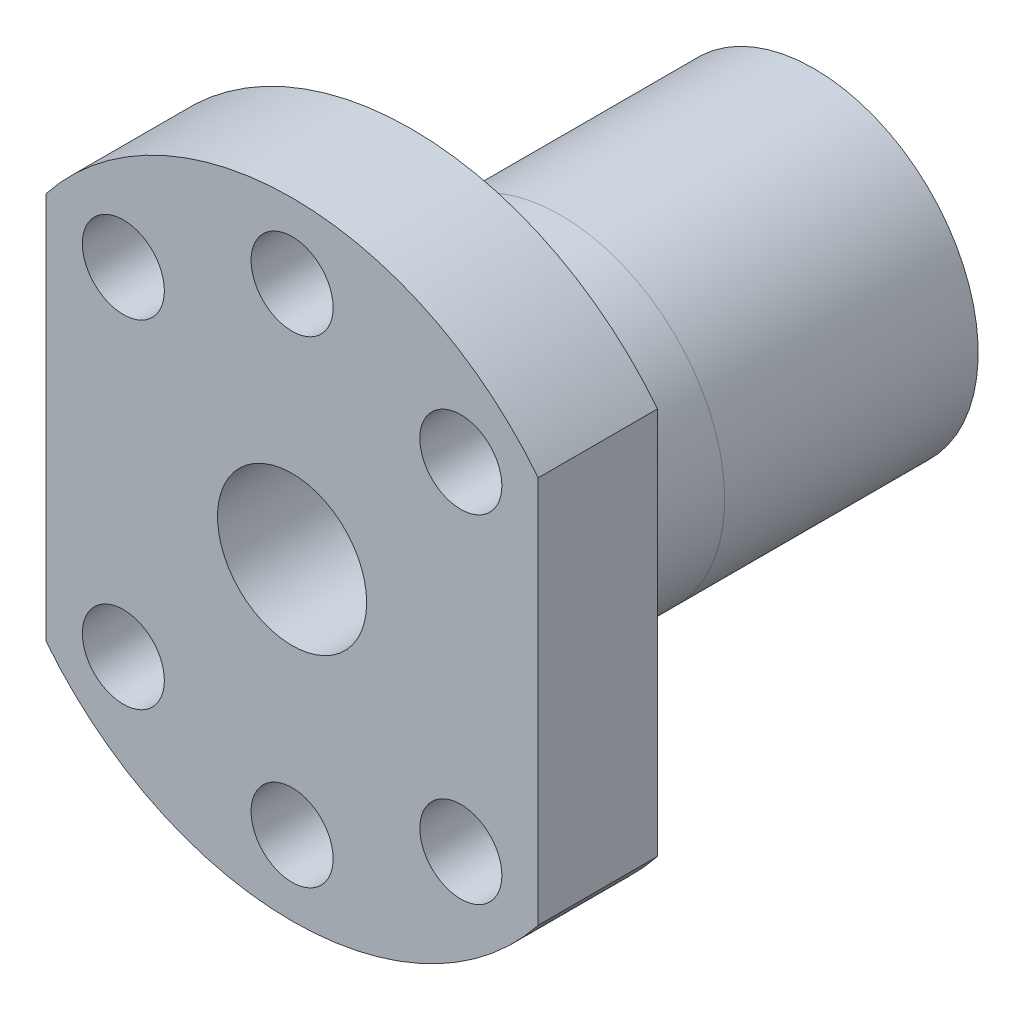
ISO-10303-21;
HEADER;
FILE_DESCRIPTION(('STEP AP214'),'2;1');
FILE_NAME('part.step','',(''),(''),'','','');
FILE_SCHEMA(('AUTOMOTIVE_DESIGN { 1 0 10303 214 1 1 1 1 }'));
ENDSEC;
DATA;
#1=APPLICATION_CONTEXT('core data for automotive mechanical design processes');
#2=APPLICATION_PROTOCOL_DEFINITION('international standard','automotive_design',2000,#1);
#3=PRODUCT_CONTEXT('',#1,'mechanical');
#4=PRODUCT('Part','Part','',(#3));
#5=PRODUCT_RELATED_PRODUCT_CATEGORY('part','',(#4));
#6=PRODUCT_DEFINITION_FORMATION('','',#4);
#7=PRODUCT_DEFINITION_CONTEXT('part definition',#1,'design');
#8=PRODUCT_DEFINITION('design','',#6,#7);
#9=PRODUCT_DEFINITION_SHAPE('','',#8);
#10=(LENGTH_UNIT() NAMED_UNIT(*) SI_UNIT(.MILLI.,.METRE.));
#11=(NAMED_UNIT(*) PLANE_ANGLE_UNIT() SI_UNIT($,.RADIAN.));
#12=(NAMED_UNIT(*) SI_UNIT($,.STERADIAN.) SOLID_ANGLE_UNIT());
#13=UNCERTAINTY_MEASURE_WITH_UNIT(LENGTH_MEASURE(1.E-05),#10,'distance_accuracy_value','');
#14=(GEOMETRIC_REPRESENTATION_CONTEXT(3) GLOBAL_UNCERTAINTY_ASSIGNED_CONTEXT((#13)) GLOBAL_UNIT_ASSIGNED_CONTEXT((#10,
#11,#12)) REPRESENTATION_CONTEXT('',''));
#15=CARTESIAN_POINT('',(0.,0.,0.));
#16=DIRECTION('',(0.,0.,1.));
#17=DIRECTION('',(1.,0.,0.));
#18=AXIS2_PLACEMENT_3D('',#15,#16,#17);
#19=CARTESIAN_POINT('',(0.,0.,4.));
#20=DIRECTION('',(0.,0.,1.));
#21=DIRECTION('',(0.,-1.,0.));
#22=AXIS2_PLACEMENT_3D('',#19,#20,#21);
#23=CYLINDRICAL_SURFACE('',#22,11.);
#24=CARTESIAN_POINT('',(0.,0.,-4.));
#25=DIRECTION('',(0.,0.,1.));
#26=DIRECTION('',(0.,-1.,0.));
#27=AXIS2_PLACEMENT_3D('',#24,#25,#26);
#28=CIRCLE('',#27,11.);
#29=CARTESIAN_POINT('',(0.,-11.,-4.));
#30=VERTEX_POINT('',#29);
#31=EDGE_CURVE('E116',#30,#30,#28,.T.);
#32=ORIENTED_EDGE('',*,*,#31,.F.);
#33=EDGE_LOOP('',(#32));
#34=FACE_BOUND('',#33,.T.);
#35=CARTESIAN_POINT('',(0.,0.,-14.));
#36=DIRECTION('',(0.,0.,-1.));
#37=DIRECTION('',(0.,1.,0.));
#38=AXIS2_PLACEMENT_3D('',#35,#36,#37);
#39=CIRCLE('',#38,11.);
#40=CARTESIAN_POINT('',(0.,11.,-14.));
#41=VERTEX_POINT('',#40);
#42=CARTESIAN_POINT('',(0.,-11.,-14.));
#43=VERTEX_POINT('',#42);
#44=EDGE_CURVE('E11',#41,#43,#39,.T.);
#45=ORIENTED_EDGE('',*,*,#44,.F.);
#46=EDGE_CURVE('E47',#43,#41,#39,.T.);
#47=ORIENTED_EDGE('',*,*,#46,.F.);
#48=EDGE_LOOP('',(#45,#47));
#49=FACE_BOUND('',#48,.T.);
#50=ADVANCED_FACE('F43',(#34,#49),#23,.T.);
#51=CARTESIAN_POINT('',(0.,0.,4.));
#52=DIRECTION('',(0.,0.,-1.));
#53=DIRECTION('',(0.,1.,0.));
#54=AXIS2_PLACEMENT_3D('',#51,#52,#53);
#55=PLANE('',#54);
#56=CARTESIAN_POINT('',(0.,0.,4.));
#57=DIRECTION('',(0.,0.,1.));
#58=DIRECTION('',(1.,0.,0.));
#59=AXIS2_PLACEMENT_3D('',#56,#57,#58);
#60=CIRCLE('',#59,5.);
#61=CARTESIAN_POINT('',(5.,0.,4.));
#62=VERTEX_POINT('',#61);
#63=EDGE_CURVE('E171',#62,#62,#60,.T.);
#64=ORIENTED_EDGE('',*,*,#63,.F.);
#65=EDGE_LOOP('',(#64));
#66=FACE_BOUND('',#65,.T.);
#67=CARTESIAN_POINT('',(0.,-16.,4.));
#68=DIRECTION('',(0.,0.,-1.));
#69=DIRECTION('',(1.,0.,0.));
#70=AXIS2_PLACEMENT_3D('',#67,#68,#69);
#71=CIRCLE('',#70,2.75);
#72=CARTESIAN_POINT('',(2.75,-16.,4.));
#73=VERTEX_POINT('',#72);
#74=EDGE_CURVE('E160',#73,#73,#71,.T.);
#75=ORIENTED_EDGE('',*,*,#74,.T.);
#76=EDGE_LOOP('',(#75));
#77=FACE_BOUND('',#76,.T.);
#78=CARTESIAN_POINT('',(11.3137084989848,-11.3137084989847,4.));
#79=DIRECTION('',(0.,0.,-1.));
#80=DIRECTION('',(1.,0.,0.));
#81=AXIS2_PLACEMENT_3D('',#78,#79,#80);
#82=CIRCLE('',#81,2.75);
#83=CARTESIAN_POINT('',(14.0637084989848,-11.3137084989847,4.));
#84=VERTEX_POINT('',#83);
#85=EDGE_CURVE('E148',#84,#84,#82,.T.);
#86=ORIENTED_EDGE('',*,*,#85,.T.);
#87=EDGE_LOOP('',(#86));
#88=FACE_BOUND('',#87,.T.);
#89=CARTESIAN_POINT('',(-11.3137084989848,-11.3137084989847,4.));
#90=DIRECTION('',(0.,0.,-1.));
#91=DIRECTION('',(1.,0.,0.));
#92=AXIS2_PLACEMENT_3D('',#89,#90,#91);
#93=CIRCLE('',#92,2.75);
#94=CARTESIAN_POINT('',(-8.56370849898478,-11.3137084989847,4.));
#95=VERTEX_POINT('',#94);
#96=EDGE_CURVE('E142',#95,#95,#93,.T.);
#97=ORIENTED_EDGE('',*,*,#96,.T.);
#98=EDGE_LOOP('',(#97));
#99=FACE_BOUND('',#98,.T.);
#100=DIRECTION('',(0.,-1.,0.));
#101=VECTOR('',#100,1.);
#102=CARTESIAN_POINT('',(16.5,12.9903810567666,4.));
#103=LINE('',#102,#101);
#104=CARTESIAN_POINT('',(16.5,12.9903810567666,4.));
#105=VERTEX_POINT('',#104);
#106=CARTESIAN_POINT('',(16.5,-12.9903810567666,4.));
#107=VERTEX_POINT('',#106);
#108=EDGE_CURVE('E88',#105,#107,#103,.T.);
#109=ORIENTED_EDGE('',*,*,#108,.F.);
#110=CARTESIAN_POINT('',(0.,0.,4.));
#111=DIRECTION('',(0.,0.,1.));
#112=DIRECTION('',(0.,-1.,0.));
#113=AXIS2_PLACEMENT_3D('',#110,#111,#112);
#114=CIRCLE('',#113,21.);
#115=CARTESIAN_POINT('',(-16.5,12.9903810567666,4.));
#116=VERTEX_POINT('',#115);
#117=EDGE_CURVE('E102',#105,#116,#114,.T.);
#118=ORIENTED_EDGE('',*,*,#117,.T.);
#119=DIRECTION('',(0.,1.,0.));
#120=VECTOR('',#119,1.);
#121=CARTESIAN_POINT('',(-16.5,-12.9903810567666,4.));
#122=LINE('',#121,#120);
#123=CARTESIAN_POINT('',(-16.5,-12.9903810567666,4.));
#124=VERTEX_POINT('',#123);
#125=EDGE_CURVE('E126',#124,#116,#122,.T.);
#126=ORIENTED_EDGE('',*,*,#125,.F.);
#127=EDGE_CURVE('E105',#124,#107,#114,.T.);
#128=ORIENTED_EDGE('',*,*,#127,.T.);
#129=EDGE_LOOP('',(#109,#118,#126,#128));
#130=FACE_BOUND('',#129,.T.);
#131=CARTESIAN_POINT('',(-11.3137084989848,11.3137084989847,4.));
#132=DIRECTION('',(0.,0.,1.));
#133=DIRECTION('',(1.,0.,0.));
#134=AXIS2_PLACEMENT_3D('',#131,#132,#133);
#135=CIRCLE('',#134,2.75);
#136=CARTESIAN_POINT('',(-8.56370849898478,11.3137084989847,4.));
#137=VERTEX_POINT('',#136);
#138=EDGE_CURVE('E131',#137,#137,#135,.T.);
#139=ORIENTED_EDGE('',*,*,#138,.F.);
#140=EDGE_LOOP('',(#139));
#141=FACE_BOUND('',#140,.T.);
#142=CARTESIAN_POINT('',(11.3137084989848,11.3137084989847,4.));
#143=DIRECTION('',(0.,0.,1.));
#144=DIRECTION('',(1.,0.,0.));
#145=AXIS2_PLACEMENT_3D('',#142,#143,#144);
#146=CIRCLE('',#145,2.75);
#147=CARTESIAN_POINT('',(14.0637084989848,11.3137084989847,4.));
#148=VERTEX_POINT('',#147);
#149=EDGE_CURVE('E136',#148,#148,#146,.T.);
#150=ORIENTED_EDGE('',*,*,#149,.F.);
#151=EDGE_LOOP('',(#150));
#152=FACE_BOUND('',#151,.T.);
#153=CARTESIAN_POINT('',(0.,16.,4.));
#154=DIRECTION('',(0.,0.,1.));
#155=DIRECTION('',(1.,0.,0.));
#156=AXIS2_PLACEMENT_3D('',#153,#154,#155);
#157=CIRCLE('',#156,2.75);
#158=CARTESIAN_POINT('',(2.75,16.,4.));
#159=VERTEX_POINT('',#158);
#160=EDGE_CURVE('E154',#159,#159,#157,.T.);
#161=ORIENTED_EDGE('',*,*,#160,.F.);
#162=EDGE_LOOP('',(#161));
#163=FACE_BOUND('',#162,.T.);
#164=ADVANCED_FACE('F45',(#66,#77,#88,#99,#130,#141,#152,#163),#55,.F.);
#165=CARTESIAN_POINT('',(0.,21.,-4.));
#166=DIRECTION('',(0.,0.,1.));
#167=DIRECTION('',(0.,-1.,0.));
#168=AXIS2_PLACEMENT_3D('',#165,#166,#167);
#169=PLANE('',#168);
#170=CARTESIAN_POINT('',(0.,-16.,-4.));
#171=DIRECTION('',(0.,0.,-1.));
#172=DIRECTION('',(1.,0.,0.));
#173=AXIS2_PLACEMENT_3D('',#170,#171,#172);
#174=CIRCLE('',#173,2.75);
#175=CARTESIAN_POINT('',(2.75,-16.,-4.));
#176=VERTEX_POINT('',#175);
#177=EDGE_CURVE('E163',#176,#176,#174,.T.);
#178=ORIENTED_EDGE('',*,*,#177,.F.);
#179=EDGE_LOOP('',(#178));
#180=FACE_BOUND('',#179,.T.);
#181=CARTESIAN_POINT('',(11.3137084989848,-11.3137084989847,-4.));
#182=DIRECTION('',(0.,0.,-1.));
#183=DIRECTION('',(1.,0.,0.));
#184=AXIS2_PLACEMENT_3D('',#181,#182,#183);
#185=CIRCLE('',#184,2.75);
#186=CARTESIAN_POINT('',(14.0637084989848,-11.3137084989847,-4.));
#187=VERTEX_POINT('',#186);
#188=EDGE_CURVE('E151',#187,#187,#185,.T.);
#189=ORIENTED_EDGE('',*,*,#188,.F.);
#190=EDGE_LOOP('',(#189));
#191=FACE_BOUND('',#190,.T.);
#192=CARTESIAN_POINT('',(-11.3137084989848,-11.3137084989847,-4.));
#193=DIRECTION('',(0.,0.,-1.));
#194=DIRECTION('',(1.,0.,0.));
#195=AXIS2_PLACEMENT_3D('',#192,#193,#194);
#196=CIRCLE('',#195,2.75);
#197=CARTESIAN_POINT('',(-8.56370849898478,-11.3137084989847,-4.));
#198=VERTEX_POINT('',#197);
#199=EDGE_CURVE('E145',#198,#198,#196,.T.);
#200=ORIENTED_EDGE('',*,*,#199,.F.);
#201=EDGE_LOOP('',(#200));
#202=FACE_BOUND('',#201,.T.);
#203=ORIENTED_EDGE('',*,*,#31,.T.);
#204=EDGE_LOOP('',(#203));
#205=FACE_BOUND('',#204,.T.);
#206=DIRECTION('',(0.,-1.,0.));
#207=VECTOR('',#206,1.);
#208=CARTESIAN_POINT('',(16.5,12.9903810567666,-4.));
#209=LINE('',#208,#207);
#210=CARTESIAN_POINT('',(16.5,12.9903810567666,-4.));
#211=VERTEX_POINT('',#210);
#212=CARTESIAN_POINT('',(16.5,-12.9903810567666,-4.));
#213=VERTEX_POINT('',#212);
#214=EDGE_CURVE('E91',#211,#213,#209,.T.);
#215=ORIENTED_EDGE('',*,*,#214,.T.);
#216=CARTESIAN_POINT('',(0.,0.,-4.));
#217=DIRECTION('',(0.,0.,1.));
#218=DIRECTION('',(0.,-1.,0.));
#219=AXIS2_PLACEMENT_3D('',#216,#217,#218);
#220=CIRCLE('',#219,21.);
#221=CARTESIAN_POINT('',(-16.5,-12.9903810567666,-4.));
#222=VERTEX_POINT('',#221);
#223=EDGE_CURVE('E111',#222,#213,#220,.T.);
#224=ORIENTED_EDGE('',*,*,#223,.F.);
#225=DIRECTION('',(0.,1.,0.));
#226=VECTOR('',#225,1.);
#227=CARTESIAN_POINT('',(-16.5,-12.9903810567666,-4.));
#228=LINE('',#227,#226);
#229=CARTESIAN_POINT('',(-16.5,12.9903810567666,-4.));
#230=VERTEX_POINT('',#229);
#231=EDGE_CURVE('E95',#222,#230,#228,.T.);
#232=ORIENTED_EDGE('',*,*,#231,.T.);
#233=EDGE_CURVE('E113',#211,#230,#220,.T.);
#234=ORIENTED_EDGE('',*,*,#233,.F.);
#235=EDGE_LOOP('',(#215,#224,#232,#234));
#236=FACE_BOUND('',#235,.T.);
#237=CARTESIAN_POINT('',(-11.3137084989848,11.3137084989847,-4.));
#238=DIRECTION('',(0.,0.,1.));
#239=DIRECTION('',(1.,0.,0.));
#240=AXIS2_PLACEMENT_3D('',#237,#238,#239);
#241=CIRCLE('',#240,2.75);
#242=CARTESIAN_POINT('',(-8.56370849898478,11.3137084989847,-4.));
#243=VERTEX_POINT('',#242);
#244=EDGE_CURVE('E133',#243,#243,#241,.T.);
#245=ORIENTED_EDGE('',*,*,#244,.T.);
#246=EDGE_LOOP('',(#245));
#247=FACE_BOUND('',#246,.T.);
#248=CARTESIAN_POINT('',(11.3137084989848,11.3137084989847,-4.));
#249=DIRECTION('',(0.,0.,1.));
#250=DIRECTION('',(1.,0.,0.));
#251=AXIS2_PLACEMENT_3D('',#248,#249,#250);
#252=CIRCLE('',#251,2.75);
#253=CARTESIAN_POINT('',(14.0637084989848,11.3137084989847,-4.));
#254=VERTEX_POINT('',#253);
#255=EDGE_CURVE('E139',#254,#254,#252,.T.);
#256=ORIENTED_EDGE('',*,*,#255,.T.);
#257=EDGE_LOOP('',(#256));
#258=FACE_BOUND('',#257,.T.);
#259=CARTESIAN_POINT('',(0.,16.,-4.));
#260=DIRECTION('',(0.,0.,1.));
#261=DIRECTION('',(1.,0.,0.));
#262=AXIS2_PLACEMENT_3D('',#259,#260,#261);
#263=CIRCLE('',#262,2.75);
#264=CARTESIAN_POINT('',(2.75,16.,-4.));
#265=VERTEX_POINT('',#264);
#266=EDGE_CURVE('E157',#265,#265,#263,.T.);
#267=ORIENTED_EDGE('',*,*,#266,.T.);
#268=EDGE_LOOP('',(#267));
#269=FACE_BOUND('',#268,.T.);
#270=ADVANCED_FACE('F179',(#180,#191,#202,#205,#236,#247,#258,#269),#169,.F.);
#271=CARTESIAN_POINT('',(0.,0.,4.));
#272=DIRECTION('',(0.,0.,1.));
#273=DIRECTION('',(0.,-1.,0.));
#274=AXIS2_PLACEMENT_3D('',#271,#272,#273);
#275=CYLINDRICAL_SURFACE('',#274,21.);
#276=DIRECTION('',(0.,0.,-1.));
#277=VECTOR('',#276,1.);
#278=CARTESIAN_POINT('',(16.5,12.9903810567666,4.));
#279=LINE('',#278,#277);
#280=EDGE_CURVE('E85',#105,#211,#279,.T.);
#281=ORIENTED_EDGE('',*,*,#280,.T.);
#282=ORIENTED_EDGE('',*,*,#233,.T.);
#283=DIRECTION('',(0.,0.,-1.));
#284=VECTOR('',#283,1.);
#285=CARTESIAN_POINT('',(-16.5,12.9903810567666,4.));
#286=LINE('',#285,#284);
#287=EDGE_CURVE('E110',#116,#230,#286,.T.);
#288=ORIENTED_EDGE('',*,*,#287,.F.);
#289=ORIENTED_EDGE('',*,*,#117,.F.);
#290=EDGE_LOOP('',(#281,#282,#288,#289));
#291=FACE_BOUND('',#290,.T.);
#292=ADVANCED_FACE('F108',(#291),#275,.T.);
#293=DIRECTION('',(0.,0.,-1.));
#294=VECTOR('',#293,1.);
#295=CARTESIAN_POINT('',(16.5,-12.9903810567666,4.));
#296=LINE('',#295,#294);
#297=EDGE_CURVE('E96',#107,#213,#296,.T.);
#298=ORIENTED_EDGE('',*,*,#297,.F.);
#299=ORIENTED_EDGE('',*,*,#127,.F.);
#300=DIRECTION('',(0.,0.,-1.));
#301=VECTOR('',#300,1.);
#302=CARTESIAN_POINT('',(-16.5,-12.9903810567666,4.));
#303=LINE('',#302,#301);
#304=EDGE_CURVE('E122',#124,#222,#303,.T.);
#305=ORIENTED_EDGE('',*,*,#304,.T.);
#306=ORIENTED_EDGE('',*,*,#223,.T.);
#307=EDGE_LOOP('',(#298,#299,#305,#306));
#308=FACE_BOUND('',#307,.T.);
#309=ADVANCED_FACE('F231',(#308),#275,.T.);
#310=ORIENTED_EDGE('',*,*,#46,.T.);
#311=ORIENTED_EDGE('',*,*,#44,.T.);
#312=EDGE_LOOP('',(#310,#311));
#313=FACE_BOUND('',#312,.T.);
#314=CARTESIAN_POINT('',(0.,0.,-31.));
#315=DIRECTION('',(0.,0.,1.));
#316=DIRECTION('',(0.,-1.,0.));
#317=AXIS2_PLACEMENT_3D('',#314,#315,#316);
#318=CIRCLE('',#317,11.);
#319=CARTESIAN_POINT('',(0.,-11.,-31.));
#320=VERTEX_POINT('',#319);
#321=EDGE_CURVE('E119',#320,#320,#318,.T.);
#322=ORIENTED_EDGE('',*,*,#321,.T.);
#323=EDGE_LOOP('',(#322));
#324=FACE_BOUND('',#323,.T.);
#325=ADVANCED_FACE('F224',(#313,#324),#23,.T.);
#326=CARTESIAN_POINT('',(0.,11.,-31.));
#327=DIRECTION('',(0.,0.,1.));
#328=DIRECTION('',(0.,-1.,0.));
#329=AXIS2_PLACEMENT_3D('',#326,#327,#328);
#330=PLANE('',#329);
#331=CARTESIAN_POINT('',(0.,0.,-31.));
#332=DIRECTION('',(0.,0.,1.));
#333=DIRECTION('',(1.,0.,0.));
#334=AXIS2_PLACEMENT_3D('',#331,#332,#333);
#335=CIRCLE('',#334,5.);
#336=CARTESIAN_POINT('',(5.,0.,-31.));
#337=VERTEX_POINT('',#336);
#338=EDGE_CURVE('E166',#337,#337,#335,.T.);
#339=ORIENTED_EDGE('',*,*,#338,.T.);
#340=EDGE_LOOP('',(#339));
#341=FACE_BOUND('',#340,.T.);
#342=ORIENTED_EDGE('',*,*,#321,.F.);
#343=EDGE_LOOP('',(#342));
#344=FACE_BOUND('',#343,.T.);
#345=ADVANCED_FACE('F230',(#341,#344),#330,.F.);
#346=CARTESIAN_POINT('',(-16.5,-12.9903810567666,4.));
#347=DIRECTION('',(-1.,0.,0.));
#348=DIRECTION('',(0.,0.,1.));
#349=AXIS2_PLACEMENT_3D('',#346,#347,#348);
#350=PLANE('',#349);
#351=ORIENTED_EDGE('',*,*,#231,.F.);
#352=ORIENTED_EDGE('',*,*,#304,.F.);
#353=ORIENTED_EDGE('',*,*,#125,.T.);
#354=ORIENTED_EDGE('',*,*,#287,.T.);
#355=EDGE_LOOP('',(#351,#352,#353,#354));
#356=FACE_BOUND('',#355,.T.);
#357=ADVANCED_FACE('F235',(#356),#350,.T.);
#358=CARTESIAN_POINT('',(16.5,12.9903810567666,4.));
#359=DIRECTION('',(1.,0.,0.));
#360=DIRECTION('',(0.,0.,-1.));
#361=AXIS2_PLACEMENT_3D('',#358,#359,#360);
#362=PLANE('',#361);
#363=ORIENTED_EDGE('',*,*,#214,.F.);
#364=ORIENTED_EDGE('',*,*,#280,.F.);
#365=ORIENTED_EDGE('',*,*,#108,.T.);
#366=ORIENTED_EDGE('',*,*,#297,.T.);
#367=EDGE_LOOP('',(#363,#364,#365,#366));
#368=FACE_BOUND('',#367,.T.);
#369=ADVANCED_FACE('F87',(#368),#362,.T.);
#370=CARTESIAN_POINT('',(-11.3137084989848,11.3137084989847,4.));
#371=DIRECTION('',(0.,0.,-1.));
#372=DIRECTION('',(-1.,0.,0.));
#373=AXIS2_PLACEMENT_3D('',#370,#371,#372);
#374=CYLINDRICAL_SURFACE('',#373,2.75);
#375=ORIENTED_EDGE('',*,*,#138,.T.);
#376=EDGE_LOOP('',(#375));
#377=FACE_BOUND('',#376,.T.);
#378=ORIENTED_EDGE('',*,*,#244,.F.);
#379=EDGE_LOOP('',(#378));
#380=FACE_BOUND('',#379,.T.);
#381=ADVANCED_FACE('F256',(#377,#380),#374,.F.);
#382=CARTESIAN_POINT('',(11.3137084989848,11.3137084989847,4.));
#383=DIRECTION('',(0.,0.,-1.));
#384=DIRECTION('',(-1.,0.,0.));
#385=AXIS2_PLACEMENT_3D('',#382,#383,#384);
#386=CYLINDRICAL_SURFACE('',#385,2.75);
#387=ORIENTED_EDGE('',*,*,#149,.T.);
#388=EDGE_LOOP('',(#387));
#389=FACE_BOUND('',#388,.T.);
#390=ORIENTED_EDGE('',*,*,#255,.F.);
#391=EDGE_LOOP('',(#390));
#392=FACE_BOUND('',#391,.T.);
#393=ADVANCED_FACE('F190',(#389,#392),#386,.F.);
#394=CARTESIAN_POINT('',(-11.3137084989848,-11.3137084989847,4.));
#395=DIRECTION('',(0.,0.,-1.));
#396=DIRECTION('',(-1.,0.,0.));
#397=AXIS2_PLACEMENT_3D('',#394,#395,#396);
#398=CYLINDRICAL_SURFACE('',#397,2.75);
#399=ORIENTED_EDGE('',*,*,#96,.F.);
#400=EDGE_LOOP('',(#399));
#401=FACE_BOUND('',#400,.T.);
#402=ORIENTED_EDGE('',*,*,#199,.T.);
#403=EDGE_LOOP('',(#402));
#404=FACE_BOUND('',#403,.T.);
#405=ADVANCED_FACE('F186',(#401,#404),#398,.F.);
#406=CARTESIAN_POINT('',(11.3137084989848,-11.3137084989847,4.));
#407=DIRECTION('',(0.,0.,-1.));
#408=DIRECTION('',(-1.,0.,0.));
#409=AXIS2_PLACEMENT_3D('',#406,#407,#408);
#410=CYLINDRICAL_SURFACE('',#409,2.75);
#411=ORIENTED_EDGE('',*,*,#85,.F.);
#412=EDGE_LOOP('',(#411));
#413=FACE_BOUND('',#412,.T.);
#414=ORIENTED_EDGE('',*,*,#188,.T.);
#415=EDGE_LOOP('',(#414));
#416=FACE_BOUND('',#415,.T.);
#417=ADVANCED_FACE('F189',(#413,#416),#410,.F.);
#418=CARTESIAN_POINT('',(0.,16.,4.));
#419=DIRECTION('',(0.,0.,-1.));
#420=DIRECTION('',(-1.,0.,0.));
#421=AXIS2_PLACEMENT_3D('',#418,#419,#420);
#422=CYLINDRICAL_SURFACE('',#421,2.75);
#423=ORIENTED_EDGE('',*,*,#160,.T.);
#424=EDGE_LOOP('',(#423));
#425=FACE_BOUND('',#424,.T.);
#426=ORIENTED_EDGE('',*,*,#266,.F.);
#427=EDGE_LOOP('',(#426));
#428=FACE_BOUND('',#427,.T.);
#429=ADVANCED_FACE('F208',(#425,#428),#422,.F.);
#430=CARTESIAN_POINT('',(0.,-16.,4.));
#431=DIRECTION('',(0.,0.,-1.));
#432=DIRECTION('',(-1.,0.,0.));
#433=AXIS2_PLACEMENT_3D('',#430,#431,#432);
#434=CYLINDRICAL_SURFACE('',#433,2.75);
#435=ORIENTED_EDGE('',*,*,#74,.F.);
#436=EDGE_LOOP('',(#435));
#437=FACE_BOUND('',#436,.T.);
#438=ORIENTED_EDGE('',*,*,#177,.T.);
#439=EDGE_LOOP('',(#438));
#440=FACE_BOUND('',#439,.T.);
#441=ADVANCED_FACE('F210',(#437,#440),#434,.F.);
#442=CARTESIAN_POINT('',(0.,0.,-31.));
#443=DIRECTION('',(0.,0.,1.));
#444=DIRECTION('',(1.,0.,0.));
#445=AXIS2_PLACEMENT_3D('',#442,#443,#444);
#446=CYLINDRICAL_SURFACE('',#445,5.);
#447=ORIENTED_EDGE('',*,*,#338,.F.);
#448=EDGE_LOOP('',(#447));
#449=FACE_BOUND('',#448,.T.);
#450=ORIENTED_EDGE('',*,*,#63,.T.);
#451=EDGE_LOOP('',(#450));
#452=FACE_BOUND('',#451,.T.);
#453=ADVANCED_FACE('F175',(#449,#452),#446,.F.);
#454=CLOSED_SHELL('',(#50,#164,#270,#292,#309,#325,#345,#357,#369,#381,#393,#405,#417,#429,#441,#453));
#455=MANIFOLD_SOLID_BREP('B2',#454);
#456=ADVANCED_BREP_SHAPE_REPRESENTATION('',(#18,#455),#14);
#457=SHAPE_DEFINITION_REPRESENTATION(#9,#456);
ENDSEC;
END-ISO-10303-21;
